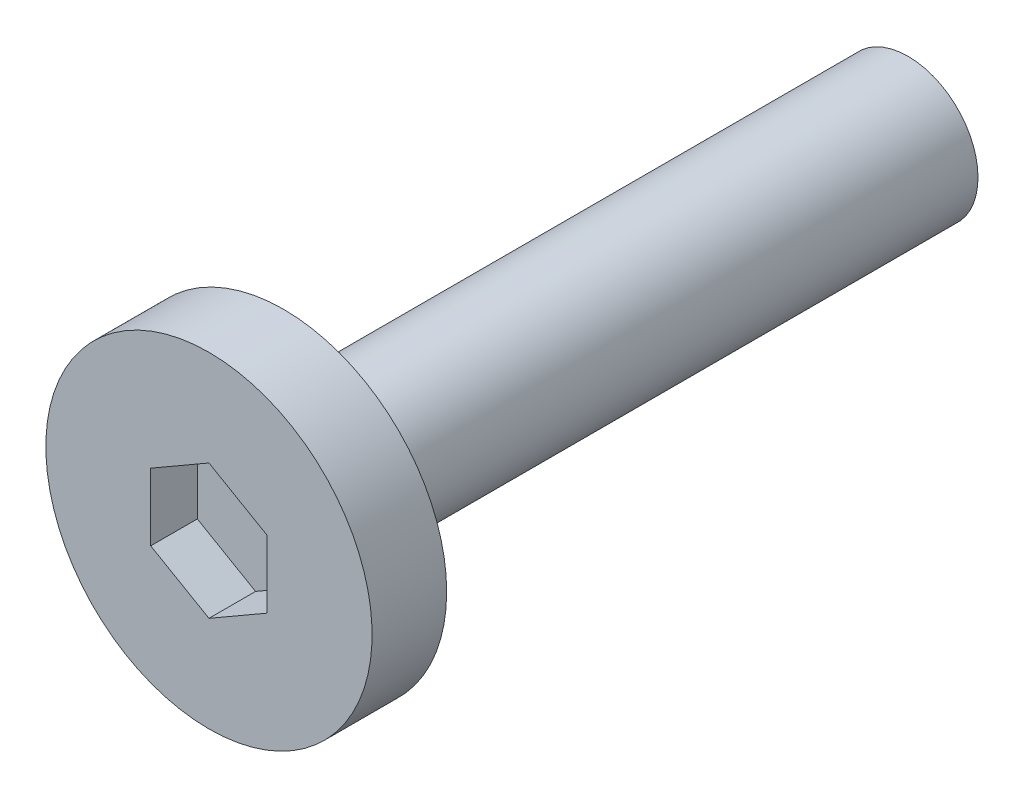
ISO-10303-21;
HEADER;
FILE_DESCRIPTION(('STEP AP214'),'2;1');
FILE_NAME('part.step','',(''),(''),'','','');
FILE_SCHEMA(('AUTOMOTIVE_DESIGN { 1 0 10303 214 1 1 1 1 }'));
ENDSEC;
DATA;
#1=APPLICATION_CONTEXT('core data for automotive mechanical design processes');
#2=APPLICATION_PROTOCOL_DEFINITION('international standard','automotive_design',2000,#1);
#3=PRODUCT_CONTEXT('',#1,'mechanical');
#4=PRODUCT('Part','Part','',(#3));
#5=PRODUCT_RELATED_PRODUCT_CATEGORY('part','',(#4));
#6=PRODUCT_DEFINITION_FORMATION('','',#4);
#7=PRODUCT_DEFINITION_CONTEXT('part definition',#1,'design');
#8=PRODUCT_DEFINITION('design','',#6,#7);
#9=PRODUCT_DEFINITION_SHAPE('','',#8);
#10=(LENGTH_UNIT() NAMED_UNIT(*) SI_UNIT(.MILLI.,.METRE.));
#11=(NAMED_UNIT(*) PLANE_ANGLE_UNIT() SI_UNIT($,.RADIAN.));
#12=(NAMED_UNIT(*) SI_UNIT($,.STERADIAN.) SOLID_ANGLE_UNIT());
#13=UNCERTAINTY_MEASURE_WITH_UNIT(LENGTH_MEASURE(1.E-05),#10,'distance_accuracy_value','');
#14=(GEOMETRIC_REPRESENTATION_CONTEXT(3) GLOBAL_UNCERTAINTY_ASSIGNED_CONTEXT((#13)) GLOBAL_UNIT_ASSIGNED_CONTEXT((#10,
#11,#12)) REPRESENTATION_CONTEXT('',''));
#15=CARTESIAN_POINT('',(0.,0.,0.));
#16=DIRECTION('',(0.,0.,1.));
#17=DIRECTION('',(1.,0.,0.));
#18=AXIS2_PLACEMENT_3D('',#15,#16,#17);
#19=CARTESIAN_POINT('',(51.3855643862837,123.456236842962,115.960489149573));
#20=DIRECTION('',(0.,0.,1.));
#21=DIRECTION('',(1.,0.,0.));
#22=AXIS2_PLACEMENT_3D('',#19,#20,#21);
#23=PLANE('',#22);
#24=DIRECTION('',(0.,-1.,0.));
#25=VECTOR('',#24,1.);
#26=CARTESIAN_POINT('',(50.1355643862837,124.177924679449,115.960489149573));
#27=LINE('',#26,#25);
#28=CARTESIAN_POINT('',(50.1355643862837,124.177924679449,115.960489149573));
#29=VERTEX_POINT('',#28);
#30=CARTESIAN_POINT('',(50.1355643862837,122.734549006475,115.960489149573));
#31=VERTEX_POINT('',#30);
#32=EDGE_CURVE('E141',#29,#31,#27,.T.);
#33=ORIENTED_EDGE('',*,*,#32,.T.);
#34=DIRECTION('',(-0.866025403784438,0.5,0.));
#35=VECTOR('',#34,1.);
#36=CARTESIAN_POINT('',(50.1355643862837,122.734549006475,115.960489149573));
#37=LINE('',#36,#35);
#38=CARTESIAN_POINT('',(51.3855643862837,122.012861169988,115.960489149573));
#39=VERTEX_POINT('',#38);
#40=EDGE_CURVE('E11',#39,#31,#37,.T.);
#41=ORIENTED_EDGE('',*,*,#40,.F.);
#42=DIRECTION('',(-0.866025403784439,-0.5,0.));
#43=VECTOR('',#42,1.);
#44=CARTESIAN_POINT('',(51.3855643862837,122.012861169988,115.960489149573));
#45=LINE('',#44,#43);
#46=CARTESIAN_POINT('',(52.6355643862837,122.734549006475,115.960489149573));
#47=VERTEX_POINT('',#46);
#48=EDGE_CURVE('E137',#47,#39,#45,.T.);
#49=ORIENTED_EDGE('',*,*,#48,.F.);
#50=DIRECTION('',(0.,1.,0.));
#51=VECTOR('',#50,1.);
#52=CARTESIAN_POINT('',(52.6355643862837,122.734549006475,115.960489149573));
#53=LINE('',#52,#51);
#54=CARTESIAN_POINT('',(52.6355643862837,124.177924679449,115.960489149573));
#55=VERTEX_POINT('',#54);
#56=EDGE_CURVE('E127',#47,#55,#53,.T.);
#57=ORIENTED_EDGE('',*,*,#56,.T.);
#58=DIRECTION('',(-0.866025403784439,0.5,0.));
#59=VECTOR('',#58,1.);
#60=CARTESIAN_POINT('',(52.6355643862837,124.177924679449,115.960489149573));
#61=LINE('',#60,#59);
#62=CARTESIAN_POINT('',(51.3855643862837,124.899612515937,115.960489149573));
#63=VERTEX_POINT('',#62);
#64=EDGE_CURVE('E105',#55,#63,#61,.T.);
#65=ORIENTED_EDGE('',*,*,#64,.T.);
#66=DIRECTION('',(-0.866025403784439,-0.5,0.));
#67=VECTOR('',#66,1.);
#68=CARTESIAN_POINT('',(51.3855643862837,124.899612515937,115.960489149573));
#69=LINE('',#68,#67);
#70=EDGE_CURVE('E47',#63,#29,#69,.T.);
#71=ORIENTED_EDGE('',*,*,#70,.T.);
#72=EDGE_LOOP('',(#33,#41,#49,#57,#65,#71));
#73=FACE_BOUND('',#72,.T.);
#74=ADVANCED_FACE('F43',(#73),#23,.T.);
#75=CARTESIAN_POINT('',(50.1355643862837,122.734549006475,120.160489149573));
#76=DIRECTION('',(0.5,0.866025403784438,0.));
#77=DIRECTION('',(0.,0.,-1.));
#78=AXIS2_PLACEMENT_3D('',#75,#76,#77);
#79=PLANE('',#78);
#80=DIRECTION('',(0.,0.,1.));
#81=VECTOR('',#80,1.);
#82=CARTESIAN_POINT('',(51.3855643862837,122.012861169988,120.160489149573));
#83=LINE('',#82,#81);
#84=CARTESIAN_POINT('',(51.3855643862837,122.012861169988,116.960489149573));
#85=VERTEX_POINT('',#84);
#86=EDGE_CURVE('E53',#39,#85,#83,.T.);
#87=ORIENTED_EDGE('',*,*,#86,.F.);
#88=ORIENTED_EDGE('',*,*,#40,.T.);
#89=DIRECTION('',(0.,0.,1.));
#90=VECTOR('',#89,1.);
#91=CARTESIAN_POINT('',(50.1355643862837,122.734549006475,120.160489149573));
#92=LINE('',#91,#90);
#93=CARTESIAN_POINT('',(50.1355643862837,122.734549006475,116.960489149573));
#94=VERTEX_POINT('',#93);
#95=EDGE_CURVE('E136',#31,#94,#92,.T.);
#96=ORIENTED_EDGE('',*,*,#95,.T.);
#97=DIRECTION('',(-0.866025403784438,0.5,0.));
#98=VECTOR('',#97,1.);
#99=CARTESIAN_POINT('',(50.7605643862837,122.373705088232,116.960489149573));
#100=LINE('',#99,#98);
#101=EDGE_CURVE('E123',#85,#94,#100,.T.);
#102=ORIENTED_EDGE('',*,*,#101,.F.);
#103=EDGE_LOOP('',(#87,#88,#96,#102));
#104=FACE_BOUND('',#103,.T.);
#105=ADVANCED_FACE('F167',(#104),#79,.T.);
#106=CARTESIAN_POINT('',(51.3855643862837,122.012861169988,120.160489149573));
#107=DIRECTION('',(-0.5,0.866025403784439,0.));
#108=DIRECTION('',(0.,0.,1.));
#109=AXIS2_PLACEMENT_3D('',#106,#107,#108);
#110=PLANE('',#109);
#111=DIRECTION('',(0.,0.,1.));
#112=VECTOR('',#111,1.);
#113=CARTESIAN_POINT('',(52.6355643862837,122.734549006475,120.160489149573));
#114=LINE('',#113,#112);
#115=CARTESIAN_POINT('',(52.6355643862837,122.734549006475,116.960489149573));
#116=VERTEX_POINT('',#115);
#117=EDGE_CURVE('E140',#47,#116,#114,.T.);
#118=ORIENTED_EDGE('',*,*,#117,.F.);
#119=ORIENTED_EDGE('',*,*,#48,.T.);
#120=ORIENTED_EDGE('',*,*,#86,.T.);
#121=DIRECTION('',(-0.866025403784439,-0.5,0.));
#122=VECTOR('',#121,1.);
#123=CARTESIAN_POINT('',(52.0105643862837,122.373705088232,116.960489149573));
#124=LINE('',#123,#122);
#125=EDGE_CURVE('E131',#116,#85,#124,.T.);
#126=ORIENTED_EDGE('',*,*,#125,.F.);
#127=EDGE_LOOP('',(#118,#119,#120,#126));
#128=FACE_BOUND('',#127,.T.);
#129=ADVANCED_FACE('F165',(#128),#110,.T.);
#130=CARTESIAN_POINT('',(52.6355643862837,122.734549006475,120.160489149573));
#131=DIRECTION('',(-1.,0.,0.));
#132=DIRECTION('',(0.,0.,1.));
#133=AXIS2_PLACEMENT_3D('',#130,#131,#132);
#134=PLANE('',#133);
#135=DIRECTION('',(0.,0.,1.));
#136=VECTOR('',#135,1.);
#137=CARTESIAN_POINT('',(52.6355643862837,124.177924679449,120.160489149573));
#138=LINE('',#137,#136);
#139=CARTESIAN_POINT('',(52.6355643862837,124.177924679449,116.960489149573));
#140=VERTEX_POINT('',#139);
#141=EDGE_CURVE('E111',#55,#140,#138,.T.);
#142=ORIENTED_EDGE('',*,*,#141,.F.);
#143=ORIENTED_EDGE('',*,*,#56,.F.);
#144=ORIENTED_EDGE('',*,*,#117,.T.);
#145=DIRECTION('',(0.,-1.,0.));
#146=VECTOR('',#145,1.);
#147=CARTESIAN_POINT('',(52.6355643862837,123.456236842962,116.960489149573));
#148=LINE('',#147,#146);
#149=EDGE_CURVE('E115',#140,#116,#148,.T.);
#150=ORIENTED_EDGE('',*,*,#149,.F.);
#151=EDGE_LOOP('',(#142,#143,#144,#150));
#152=FACE_BOUND('',#151,.T.);
#153=ADVANCED_FACE('F160',(#152),#134,.T.);
#154=CARTESIAN_POINT('',(52.6355643862837,124.177924679449,120.160489149573));
#155=DIRECTION('',(-0.5,-0.866025403784439,0.));
#156=DIRECTION('',(-0.866025403784439,0.5,0.));
#157=AXIS2_PLACEMENT_3D('',#154,#155,#156);
#158=PLANE('',#157);
#159=DIRECTION('',(0.,0.,1.));
#160=VECTOR('',#159,1.);
#161=CARTESIAN_POINT('',(51.3855643862837,124.899612515937,120.160489149573));
#162=LINE('',#161,#160);
#163=CARTESIAN_POINT('',(51.3855643862837,124.899612515937,116.960489149573));
#164=VERTEX_POINT('',#163);
#165=EDGE_CURVE('E95',#63,#164,#162,.T.);
#166=ORIENTED_EDGE('',*,*,#165,.F.);
#167=ORIENTED_EDGE('',*,*,#64,.F.);
#168=ORIENTED_EDGE('',*,*,#141,.T.);
#169=DIRECTION('',(0.866025403784439,-0.5,0.));
#170=VECTOR('',#169,1.);
#171=CARTESIAN_POINT('',(52.0105643862837,124.538768597693,116.960489149573));
#172=LINE('',#171,#170);
#173=EDGE_CURVE('E108',#164,#140,#172,.T.);
#174=ORIENTED_EDGE('',*,*,#173,.F.);
#175=EDGE_LOOP('',(#166,#167,#168,#174));
#176=FACE_BOUND('',#175,.T.);
#177=ADVANCED_FACE('F109',(#176),#158,.T.);
#178=CARTESIAN_POINT('',(51.3855643862837,124.899612515937,120.160489149573));
#179=DIRECTION('',(0.5,-0.866025403784439,0.));
#180=DIRECTION('',(0.,0.,-1.));
#181=AXIS2_PLACEMENT_3D('',#178,#179,#180);
#182=PLANE('',#181);
#183=DIRECTION('',(0.,0.,1.));
#184=VECTOR('',#183,1.);
#185=CARTESIAN_POINT('',(50.1355643862837,124.177924679449,120.160489149573));
#186=LINE('',#185,#184);
#187=CARTESIAN_POINT('',(50.1355643862837,124.177924679449,116.960489149573));
#188=VERTEX_POINT('',#187);
#189=EDGE_CURVE('E143',#29,#188,#186,.T.);
#190=ORIENTED_EDGE('',*,*,#189,.F.);
#191=ORIENTED_EDGE('',*,*,#70,.F.);
#192=ORIENTED_EDGE('',*,*,#165,.T.);
#193=DIRECTION('',(0.866025403784439,0.5,0.));
#194=VECTOR('',#193,1.);
#195=CARTESIAN_POINT('',(50.7605643862837,124.538768597693,116.960489149573));
#196=LINE('',#195,#194);
#197=EDGE_CURVE('E100',#188,#164,#196,.T.);
#198=ORIENTED_EDGE('',*,*,#197,.F.);
#199=EDGE_LOOP('',(#190,#191,#192,#198));
#200=FACE_BOUND('',#199,.T.);
#201=ADVANCED_FACE('F98',(#200),#182,.T.);
#202=CARTESIAN_POINT('',(50.1355643862837,124.177924679449,120.160489149573));
#203=DIRECTION('',(1.,0.,0.));
#204=DIRECTION('',(0.,1.,0.));
#205=AXIS2_PLACEMENT_3D('',#202,#203,#204);
#206=PLANE('',#205);
#207=ORIENTED_EDGE('',*,*,#95,.F.);
#208=ORIENTED_EDGE('',*,*,#32,.F.);
#209=ORIENTED_EDGE('',*,*,#189,.T.);
#210=DIRECTION('',(0.,1.,0.));
#211=VECTOR('',#210,1.);
#212=CARTESIAN_POINT('',(50.1355643862837,123.456236842962,116.960489149573));
#213=LINE('',#212,#211);
#214=EDGE_CURVE('E121',#94,#188,#213,.T.);
#215=ORIENTED_EDGE('',*,*,#214,.F.);
#216=EDGE_LOOP('',(#207,#208,#209,#215));
#217=FACE_BOUND('',#216,.T.);
#218=ADVANCED_FACE('F45',(#217),#206,.T.);
#219=CARTESIAN_POINT('',(51.3855643862836,123.456236842962,101.960489149573));
#220=DIRECTION('',(0.,0.,-1.));
#221=DIRECTION('',(-1.,0.,0.));
#222=AXIS2_PLACEMENT_3D('',#219,#220,#221);
#223=PLANE('',#222);
#224=CARTESIAN_POINT('',(51.3855643862836,123.456236842962,101.960489149573));
#225=DIRECTION('',(0.,0.,-1.));
#226=DIRECTION('',(-1.,0.,0.));
#227=AXIS2_PLACEMENT_3D('',#224,#225,#226);
#228=CIRCLE('',#227,1.5);
#229=CARTESIAN_POINT('',(49.8855643862836,123.456236842962,101.960489149573));
#230=VERTEX_POINT('',#229);
#231=EDGE_CURVE('E133',#230,#230,#228,.T.);
#232=ORIENTED_EDGE('',*,*,#231,.T.);
#233=EDGE_LOOP('',(#232));
#234=FACE_BOUND('',#233,.T.);
#235=ADVANCED_FACE('F209',(#234),#223,.T.);
#236=CARTESIAN_POINT('',(51.3855643862837,123.456236842962,106.960489149573));
#237=DIRECTION('',(0.,0.,1.));
#238=DIRECTION('',(1.,0.,0.));
#239=AXIS2_PLACEMENT_3D('',#236,#237,#238);
#240=CYLINDRICAL_SURFACE('',#239,1.5);
#241=CARTESIAN_POINT('',(51.3855643862837,123.456236842962,115.360489149573));
#242=DIRECTION('',(0.,0.,-1.));
#243=DIRECTION('',(1.,0.,0.));
#244=AXIS2_PLACEMENT_3D('',#241,#242,#243);
#245=CIRCLE('',#244,1.5);
#246=CARTESIAN_POINT('',(52.8855643862837,123.456236842962,115.360489149573));
#247=VERTEX_POINT('',#246);
#248=EDGE_CURVE('E130',#247,#247,#245,.T.);
#249=ORIENTED_EDGE('',*,*,#248,.T.);
#250=EDGE_LOOP('',(#249));
#251=FACE_BOUND('',#250,.T.);
#252=ORIENTED_EDGE('',*,*,#231,.F.);
#253=EDGE_LOOP('',(#252));
#254=FACE_BOUND('',#253,.T.);
#255=ADVANCED_FACE('F192',(#251,#254),#240,.T.);
#256=CARTESIAN_POINT('',(51.3855643862837,123.456236842962,115.360489149573));
#257=DIRECTION('',(0.,0.,1.));
#258=DIRECTION('',(1.,0.,0.));
#259=AXIS2_PLACEMENT_3D('',#256,#257,#258);
#260=PLANE('',#259);
#261=CARTESIAN_POINT('',(51.3855643862837,123.456236842962,115.360489149573));
#262=DIRECTION('',(0.,0.,-1.));
#263=DIRECTION('',(1.,0.,0.));
#264=AXIS2_PLACEMENT_3D('',#261,#262,#263);
#265=CIRCLE('',#264,3.5);
#266=CARTESIAN_POINT('',(54.8855643862837,123.456236842962,115.360489149573));
#267=VERTEX_POINT('',#266);
#268=EDGE_CURVE('E128',#267,#267,#265,.T.);
#269=ORIENTED_EDGE('',*,*,#268,.T.);
#270=EDGE_LOOP('',(#269));
#271=FACE_BOUND('',#270,.T.);
#272=ORIENTED_EDGE('',*,*,#248,.F.);
#273=EDGE_LOOP('',(#272));
#274=FACE_BOUND('',#273,.T.);
#275=ADVANCED_FACE('F179',(#271,#274),#260,.F.);
#276=CARTESIAN_POINT('',(51.3855643862837,123.456236842962,115.460489149573));
#277=DIRECTION('',(0.,0.,1.));
#278=DIRECTION('',(-1.,0.,0.));
#279=AXIS2_PLACEMENT_3D('',#276,#277,#278);
#280=CYLINDRICAL_SURFACE('',#279,3.5);
#281=CARTESIAN_POINT('',(51.3855643862837,123.456236842962,116.960489149573));
#282=DIRECTION('',(0.,0.,-1.));
#283=DIRECTION('',(0.,1.,0.));
#284=AXIS2_PLACEMENT_3D('',#281,#282,#283);
#285=CIRCLE('',#284,3.5);
#286=CARTESIAN_POINT('',(51.3855643862837,126.956236842962,116.960489149573));
#287=VERTEX_POINT('',#286);
#288=EDGE_CURVE('E147',#287,#287,#285,.T.);
#289=ORIENTED_EDGE('',*,*,#288,.T.);
#290=EDGE_LOOP('',(#289));
#291=FACE_BOUND('',#290,.T.);
#292=ORIENTED_EDGE('',*,*,#268,.F.);
#293=EDGE_LOOP('',(#292));
#294=FACE_BOUND('',#293,.T.);
#295=ADVANCED_FACE('F182',(#291,#294),#280,.T.);
#296=CARTESIAN_POINT('',(51.3855643862837,123.456236842962,116.960489149573));
#297=DIRECTION('',(0.,0.,1.));
#298=DIRECTION('',(1.,0.,0.));
#299=AXIS2_PLACEMENT_3D('',#296,#297,#298);
#300=PLANE('',#299);
#301=ORIENTED_EDGE('',*,*,#101,.T.);
#302=ORIENTED_EDGE('',*,*,#214,.T.);
#303=ORIENTED_EDGE('',*,*,#197,.T.);
#304=ORIENTED_EDGE('',*,*,#173,.T.);
#305=ORIENTED_EDGE('',*,*,#149,.T.);
#306=ORIENTED_EDGE('',*,*,#125,.T.);
#307=EDGE_LOOP('',(#301,#302,#303,#304,#305,#306));
#308=FACE_BOUND('',#307,.T.);
#309=ORIENTED_EDGE('',*,*,#288,.F.);
#310=EDGE_LOOP('',(#309));
#311=FACE_BOUND('',#310,.T.);
#312=ADVANCED_FACE('F118',(#308,#311),#300,.T.);
#313=CLOSED_SHELL('',(#74,#105,#129,#153,#177,#201,#218,#235,#255,#275,#295,#312));
#314=MANIFOLD_SOLID_BREP('B2',#313);
#315=ADVANCED_BREP_SHAPE_REPRESENTATION('',(#18,#314),#14);
#316=SHAPE_DEFINITION_REPRESENTATION(#9,#315);
ENDSEC;
END-ISO-10303-21;
